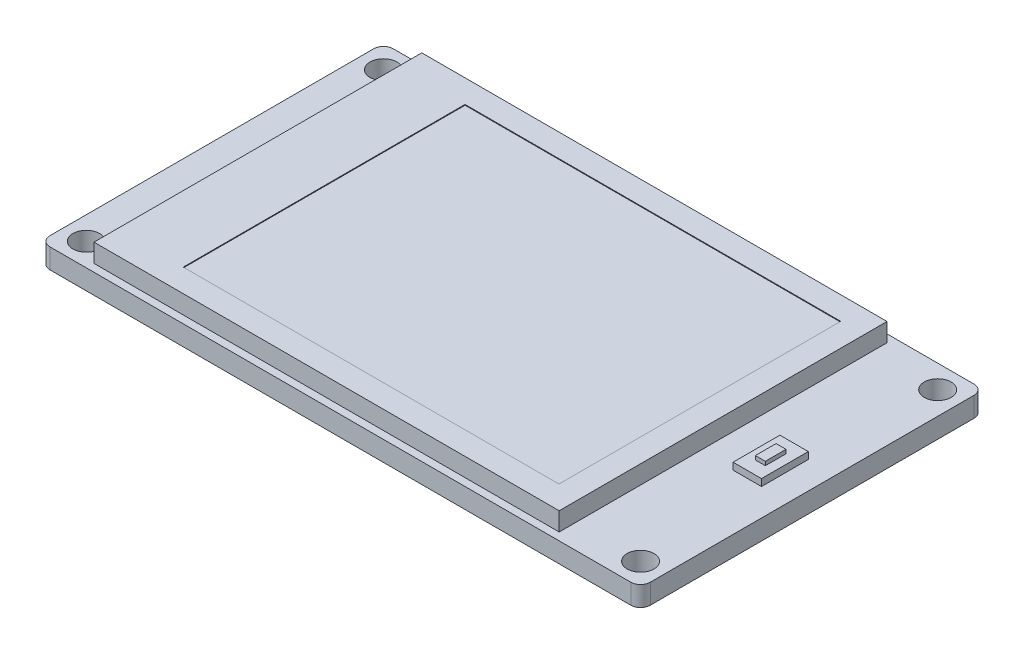
ISO-10303-21;
HEADER;
FILE_DESCRIPTION(('STEP AP214'),'2;1');
FILE_NAME('part.step','',(''),(''),'','','');
FILE_SCHEMA(('AUTOMOTIVE_DESIGN { 1 0 10303 214 1 1 1 1 }'));
ENDSEC;
DATA;
#1=APPLICATION_CONTEXT('core data for automotive mechanical design processes');
#2=APPLICATION_PROTOCOL_DEFINITION('international standard','automotive_design',2000,#1);
#3=PRODUCT_CONTEXT('',#1,'mechanical');
#4=PRODUCT('Part','Part','',(#3));
#5=PRODUCT_RELATED_PRODUCT_CATEGORY('part','',(#4));
#6=PRODUCT_DEFINITION_FORMATION('','',#4);
#7=PRODUCT_DEFINITION_CONTEXT('part definition',#1,'design');
#8=PRODUCT_DEFINITION('design','',#6,#7);
#9=PRODUCT_DEFINITION_SHAPE('','',#8);
#10=(LENGTH_UNIT() NAMED_UNIT(*) SI_UNIT(.MILLI.,.METRE.));
#11=(NAMED_UNIT(*) PLANE_ANGLE_UNIT() SI_UNIT($,.RADIAN.));
#12=(NAMED_UNIT(*) SI_UNIT($,.STERADIAN.) SOLID_ANGLE_UNIT());
#13=UNCERTAINTY_MEASURE_WITH_UNIT(LENGTH_MEASURE(1.E-05),#10,'distance_accuracy_value','');
#14=(GEOMETRIC_REPRESENTATION_CONTEXT(3) GLOBAL_UNCERTAINTY_ASSIGNED_CONTEXT((#13)) GLOBAL_UNIT_ASSIGNED_CONTEXT((#10,
#11,#12)) REPRESENTATION_CONTEXT('',''));
#15=CARTESIAN_POINT('',(0.,0.,0.));
#16=DIRECTION('',(0.,0.,1.));
#17=DIRECTION('',(1.,0.,0.));
#18=AXIS2_PLACEMENT_3D('',#15,#16,#17);
#19=CARTESIAN_POINT('',(-39.61,-2.,-13.14));
#20=DIRECTION('',(-1.,0.,0.));
#21=DIRECTION('',(0.,0.,1.));
#22=AXIS2_PLACEMENT_3D('',#19,#20,#21);
#23=PLANE('',#22);
#24=DIRECTION('',(0.,0.,1.));
#25=VECTOR('',#24,1.);
#26=CARTESIAN_POINT('',(-39.61,0.,-13.14));
#27=LINE('',#26,#25);
#28=CARTESIAN_POINT('',(-39.61,0.,-13.14));
#29=VERTEX_POINT('',#28);
#30=CARTESIAN_POINT('',(-39.61,0.,13.36));
#31=VERTEX_POINT('',#30);
#32=EDGE_CURVE('E115',#29,#31,#27,.T.);
#33=ORIENTED_EDGE('',*,*,#32,.F.);
#34=DIRECTION('',(0.,1.,0.));
#35=VECTOR('',#34,1.);
#36=CARTESIAN_POINT('',(-39.61,-2.,-13.14));
#37=LINE('',#36,#35);
#38=CARTESIAN_POINT('',(-39.61,-2.,-13.14));
#39=VERTEX_POINT('',#38);
#40=EDGE_CURVE('E12',#39,#29,#37,.T.);
#41=ORIENTED_EDGE('',*,*,#40,.F.);
#42=DIRECTION('',(0.,0.,1.));
#43=VECTOR('',#42,1.);
#44=CARTESIAN_POINT('',(-39.61,-2.,-13.14));
#45=LINE('',#44,#43);
#46=CARTESIAN_POINT('',(-39.61,-2.,13.36));
#47=VERTEX_POINT('',#46);
#48=EDGE_CURVE('E109',#39,#47,#45,.T.);
#49=ORIENTED_EDGE('',*,*,#48,.T.);
#50=DIRECTION('',(0.,1.,0.));
#51=VECTOR('',#50,1.);
#52=CARTESIAN_POINT('',(-39.61,-2.,13.36));
#53=LINE('',#52,#51);
#54=EDGE_CURVE('E54',#47,#31,#53,.T.);
#55=ORIENTED_EDGE('',*,*,#54,.T.);
#56=EDGE_LOOP('',(#33,#41,#49,#55));
#57=FACE_BOUND('',#56,.T.);
#58=ADVANCED_FACE('F51',(#57),#23,.T.);
#59=CARTESIAN_POINT('',(-39.61,-2.,-13.14));
#60=DIRECTION('',(0.,0.,-1.));
#61=DIRECTION('',(-1.,0.,0.));
#62=AXIS2_PLACEMENT_3D('',#59,#60,#61);
#63=PLANE('',#62);
#64=DIRECTION('',(-1.,0.,0.));
#65=VECTOR('',#64,1.);
#66=CARTESIAN_POINT('',(-39.61,0.,-13.14));
#67=LINE('',#66,#65);
#68=CARTESIAN_POINT('',(-39.11,0.,-13.14));
#69=VERTEX_POINT('',#68);
#70=EDGE_CURVE('E111',#69,#29,#67,.T.);
#71=ORIENTED_EDGE('',*,*,#70,.F.);
#72=DIRECTION('',(0.,1.,0.));
#73=VECTOR('',#72,1.);
#74=CARTESIAN_POINT('',(-39.11,-2.,-13.14));
#75=LINE('',#74,#73);
#76=CARTESIAN_POINT('',(-39.11,-2.,-13.14));
#77=VERTEX_POINT('',#76);
#78=EDGE_CURVE('E60',#77,#69,#75,.T.);
#79=ORIENTED_EDGE('',*,*,#78,.F.);
#80=DIRECTION('',(-1.,0.,0.));
#81=VECTOR('',#80,1.);
#82=CARTESIAN_POINT('',(-39.61,-2.,-13.14));
#83=LINE('',#82,#81);
#84=EDGE_CURVE('E106',#77,#39,#83,.T.);
#85=ORIENTED_EDGE('',*,*,#84,.T.);
#86=ORIENTED_EDGE('',*,*,#40,.T.);
#87=EDGE_LOOP('',(#71,#79,#85,#86));
#88=FACE_BOUND('',#87,.T.);
#89=ADVANCED_FACE('F125',(#88),#63,.T.);
#90=CARTESIAN_POINT('',(-39.11,-2.,-13.14));
#91=DIRECTION('',(1.,0.,0.));
#92=DIRECTION('',(0.,0.,-1.));
#93=AXIS2_PLACEMENT_3D('',#90,#91,#92);
#94=PLANE('',#93);
#95=DIRECTION('',(0.,0.,-1.));
#96=VECTOR('',#95,1.);
#97=CARTESIAN_POINT('',(-39.11,0.,-13.14));
#98=LINE('',#97,#96);
#99=CARTESIAN_POINT('',(-39.11,0.,13.36));
#100=VERTEX_POINT('',#99);
#101=EDGE_CURVE('E101',#100,#69,#98,.T.);
#102=ORIENTED_EDGE('',*,*,#101,.F.);
#103=DIRECTION('',(0.,1.,0.));
#104=VECTOR('',#103,1.);
#105=CARTESIAN_POINT('',(-39.11,-2.,13.36));
#106=LINE('',#105,#104);
#107=CARTESIAN_POINT('',(-39.11,-2.,13.36));
#108=VERTEX_POINT('',#107);
#109=EDGE_CURVE('E96',#108,#100,#106,.T.);
#110=ORIENTED_EDGE('',*,*,#109,.F.);
#111=DIRECTION('',(0.,0.,-1.));
#112=VECTOR('',#111,1.);
#113=CARTESIAN_POINT('',(-39.11,-2.,-13.14));
#114=LINE('',#113,#112);
#115=EDGE_CURVE('E99',#108,#77,#114,.T.);
#116=ORIENTED_EDGE('',*,*,#115,.T.);
#117=ORIENTED_EDGE('',*,*,#78,.T.);
#118=EDGE_LOOP('',(#102,#110,#116,#117));
#119=FACE_BOUND('',#118,.T.);
#120=ADVANCED_FACE('F98',(#119),#94,.T.);
#121=CARTESIAN_POINT('',(-39.61,-2.,13.36));
#122=DIRECTION('',(0.,0.,1.));
#123=DIRECTION('',(1.,0.,0.));
#124=AXIS2_PLACEMENT_3D('',#121,#122,#123);
#125=PLANE('',#124);
#126=DIRECTION('',(1.,0.,0.));
#127=VECTOR('',#126,1.);
#128=CARTESIAN_POINT('',(-39.61,0.,13.36));
#129=LINE('',#128,#127);
#130=EDGE_CURVE('E118',#31,#100,#129,.T.);
#131=ORIENTED_EDGE('',*,*,#130,.F.);
#132=ORIENTED_EDGE('',*,*,#54,.F.);
#133=DIRECTION('',(1.,0.,0.));
#134=VECTOR('',#133,1.);
#135=CARTESIAN_POINT('',(-39.61,-2.,13.36));
#136=LINE('',#135,#134);
#137=EDGE_CURVE('E105',#47,#108,#136,.T.);
#138=ORIENTED_EDGE('',*,*,#137,.T.);
#139=ORIENTED_EDGE('',*,*,#109,.T.);
#140=EDGE_LOOP('',(#131,#132,#138,#139));
#141=FACE_BOUND('',#140,.T.);
#142=ADVANCED_FACE('F108',(#141),#125,.T.);
#143=CARTESIAN_POINT('',(0.,-2.,0.));
#144=DIRECTION('',(0.,1.,0.));
#145=DIRECTION('',(0.,0.,1.));
#146=AXIS2_PLACEMENT_3D('',#143,#144,#145);
#147=PLANE('',#146);
#148=ORIENTED_EDGE('',*,*,#48,.F.);
#149=ORIENTED_EDGE('',*,*,#84,.F.);
#150=ORIENTED_EDGE('',*,*,#115,.F.);
#151=ORIENTED_EDGE('',*,*,#137,.F.);
#152=EDGE_LOOP('',(#148,#149,#150,#151));
#153=FACE_BOUND('',#152,.T.);
#154=ADVANCED_FACE('F104',(#153),#147,.F.);
#155=CARTESIAN_POINT('',(0.,0.,0.));
#156=DIRECTION('',(0.,1.,0.));
#157=DIRECTION('',(0.,0.,1.));
#158=AXIS2_PLACEMENT_3D('',#155,#156,#157);
#159=PLANE('',#158);
#160=ORIENTED_EDGE('',*,*,#32,.T.);
#161=ORIENTED_EDGE('',*,*,#130,.T.);
#162=ORIENTED_EDGE('',*,*,#101,.T.);
#163=ORIENTED_EDGE('',*,*,#70,.T.);
#164=EDGE_LOOP('',(#160,#161,#162,#163));
#165=FACE_BOUND('',#164,.T.);
#166=ADVANCED_FACE('F124',(#165),#159,.T.);
#167=CLOSED_SHELL('',(#58,#89,#120,#142,#154,#166));
#168=MANIFOLD_SOLID_BREP('B2',#167);
#169=CARTESIAN_POINT('',(0.,2.6,0.));
#170=DIRECTION('',(0.,1.,0.));
#171=DIRECTION('',(0.,0.,1.));
#172=AXIS2_PLACEMENT_3D('',#169,#170,#171);
#173=PLANE('',#172);
#174=CARTESIAN_POINT('',(-36.11,2.6,-19.36));
#175=DIRECTION('',(0.,1.,0.));
#176=DIRECTION('',(0.,0.,1.));
#177=AXIS2_PLACEMENT_3D('',#174,#175,#176);
#178=CIRCLE('',#177,1.75);
#179=CARTESIAN_POINT('',(-36.11,2.6,-17.61));
#180=VERTEX_POINT('',#179);
#181=EDGE_CURVE('E467',#180,#180,#178,.F.);
#182=ORIENTED_EDGE('',*,*,#181,.T.);
#183=EDGE_LOOP('',(#182));
#184=FACE_BOUND('',#183,.T.);
#185=DIRECTION('',(1.,0.,0.));
#186=VECTOR('',#185,1.);
#187=CARTESIAN_POINT('',(0.,2.6,22.36));
#188=LINE('',#187,#186);
#189=CARTESIAN_POINT('',(-37.84,2.6,22.36));
#190=VERTEX_POINT('',#189);
#191=CARTESIAN_POINT('',(37.84,2.6,22.36));
#192=VERTEX_POINT('',#191);
#193=EDGE_CURVE('E443',#190,#192,#188,.T.);
#194=ORIENTED_EDGE('',*,*,#193,.T.);
#195=CARTESIAN_POINT('',(37.84,2.6,21.09));
#196=DIRECTION('',(0.,1.,0.));
#197=DIRECTION('',(0.,0.,1.));
#198=AXIS2_PLACEMENT_3D('',#195,#196,#197);
#199=CIRCLE('',#198,1.27);
#200=CARTESIAN_POINT('',(39.11,2.6,21.09));
#201=VERTEX_POINT('',#200);
#202=EDGE_CURVE('E446',#192,#201,#199,.T.);
#203=ORIENTED_EDGE('',*,*,#202,.T.);
#204=DIRECTION('',(0.,0.,1.));
#205=VECTOR('',#204,1.);
#206=CARTESIAN_POINT('',(39.11,2.6,0.));
#207=LINE('',#206,#205);
#208=CARTESIAN_POINT('',(39.11,2.6,-21.09));
#209=VERTEX_POINT('',#208);
#210=EDGE_CURVE('E449',#209,#201,#207,.T.);
#211=ORIENTED_EDGE('',*,*,#210,.F.);
#212=CARTESIAN_POINT('',(37.84,2.6,-21.09));
#213=DIRECTION('',(0.,1.,0.));
#214=DIRECTION('',(0.,0.,1.));
#215=AXIS2_PLACEMENT_3D('',#212,#213,#214);
#216=CIRCLE('',#215,1.27);
#217=CARTESIAN_POINT('',(37.84,2.6,-22.36));
#218=VERTEX_POINT('',#217);
#219=EDGE_CURVE('E452',#218,#209,#216,.F.);
#220=ORIENTED_EDGE('',*,*,#219,.F.);
#221=DIRECTION('',(1.,0.,0.));
#222=VECTOR('',#221,1.);
#223=CARTESIAN_POINT('',(0.,2.6,-22.36));
#224=LINE('',#223,#222);
#225=CARTESIAN_POINT('',(-37.84,2.6,-22.36));
#226=VERTEX_POINT('',#225);
#227=EDGE_CURVE('E455',#226,#218,#224,.T.);
#228=ORIENTED_EDGE('',*,*,#227,.F.);
#229=CARTESIAN_POINT('',(-37.84,2.6,-21.09));
#230=DIRECTION('',(0.,1.,0.));
#231=DIRECTION('',(0.,0.,1.));
#232=AXIS2_PLACEMENT_3D('',#229,#230,#231);
#233=CIRCLE('',#232,1.27);
#234=CARTESIAN_POINT('',(-39.11,2.6,-21.09));
#235=VERTEX_POINT('',#234);
#236=EDGE_CURVE('E458',#226,#235,#233,.T.);
#237=ORIENTED_EDGE('',*,*,#236,.T.);
#238=DIRECTION('',(0.,0.,1.));
#239=VECTOR('',#238,1.);
#240=CARTESIAN_POINT('',(-39.11,2.6,0.));
#241=LINE('',#240,#239);
#242=CARTESIAN_POINT('',(-39.11,2.6,21.09));
#243=VERTEX_POINT('',#242);
#244=EDGE_CURVE('E461',#235,#243,#241,.T.);
#245=ORIENTED_EDGE('',*,*,#244,.T.);
#246=CARTESIAN_POINT('',(-37.84,2.6,21.09));
#247=DIRECTION('',(0.,1.,0.));
#248=DIRECTION('',(0.,0.,1.));
#249=AXIS2_PLACEMENT_3D('',#246,#247,#248);
#250=CIRCLE('',#249,1.27);
#251=EDGE_CURVE('E464',#243,#190,#250,.T.);
#252=ORIENTED_EDGE('',*,*,#251,.T.);
#253=EDGE_LOOP('',(#194,#203,#211,#220,#228,#237,#245,#252));
#254=FACE_BOUND('',#253,.T.);
#255=CARTESIAN_POINT('',(-36.11,2.6,19.36));
#256=DIRECTION('',(0.,1.,0.));
#257=DIRECTION('',(0.,0.,1.));
#258=AXIS2_PLACEMENT_3D('',#255,#256,#257);
#259=CIRCLE('',#258,1.75);
#260=CARTESIAN_POINT('',(-36.11,2.6,21.11));
#261=VERTEX_POINT('',#260);
#262=EDGE_CURVE('E440',#261,#261,#259,.T.);
#263=ORIENTED_EDGE('',*,*,#262,.F.);
#264=EDGE_LOOP('',(#263));
#265=FACE_BOUND('',#264,.T.);
#266=DIRECTION('',(1.,0.,0.));
#267=VECTOR('',#266,1.);
#268=CARTESIAN_POINT('',(0.,2.6,-21.36));
#269=LINE('',#268,#267);
#270=CARTESIAN_POINT('',(-33.11,2.6,-21.36));
#271=VERTEX_POINT('',#270);
#272=CARTESIAN_POINT('',(27.51,2.6,-21.36));
#273=VERTEX_POINT('',#272);
#274=EDGE_CURVE('E430',#271,#273,#269,.T.);
#275=ORIENTED_EDGE('',*,*,#274,.T.);
#276=DIRECTION('',(0.,0.,1.));
#277=VECTOR('',#276,1.);
#278=CARTESIAN_POINT('',(27.51,2.6,0.));
#279=LINE('',#278,#277);
#280=CARTESIAN_POINT('',(27.51,2.6,21.36));
#281=VERTEX_POINT('',#280);
#282=EDGE_CURVE('E432',#273,#281,#279,.T.);
#283=ORIENTED_EDGE('',*,*,#282,.T.);
#284=DIRECTION('',(1.,0.,0.));
#285=VECTOR('',#284,1.);
#286=CARTESIAN_POINT('',(0.,2.6,21.36));
#287=LINE('',#286,#285);
#288=CARTESIAN_POINT('',(-33.11,2.6,21.36));
#289=VERTEX_POINT('',#288);
#290=EDGE_CURVE('E434',#289,#281,#287,.T.);
#291=ORIENTED_EDGE('',*,*,#290,.F.);
#292=DIRECTION('',(0.,0.,1.));
#293=VECTOR('',#292,1.);
#294=CARTESIAN_POINT('',(-33.11,2.6,0.));
#295=LINE('',#294,#293);
#296=EDGE_CURVE('E437',#271,#289,#295,.T.);
#297=ORIENTED_EDGE('',*,*,#296,.F.);
#298=EDGE_LOOP('',(#275,#283,#291,#297));
#299=FACE_BOUND('',#298,.T.);
#300=CARTESIAN_POINT('',(36.11,2.6,19.36));
#301=DIRECTION('',(0.,1.,0.));
#302=DIRECTION('',(0.,0.,1.));
#303=AXIS2_PLACEMENT_3D('',#300,#301,#302);
#304=CIRCLE('',#303,1.75);
#305=CARTESIAN_POINT('',(36.11,2.6,21.11));
#306=VERTEX_POINT('',#305);
#307=EDGE_CURVE('E427',#306,#306,#304,.F.);
#308=ORIENTED_EDGE('',*,*,#307,.T.);
#309=EDGE_LOOP('',(#308));
#310=FACE_BOUND('',#309,.T.);
#311=CARTESIAN_POINT('',(36.11,2.6,-19.36));
#312=DIRECTION('',(0.,1.,0.));
#313=DIRECTION('',(0.,0.,1.));
#314=AXIS2_PLACEMENT_3D('',#311,#312,#313);
#315=CIRCLE('',#314,1.75);
#316=CARTESIAN_POINT('',(36.11,2.6,-17.61));
#317=VERTEX_POINT('',#316);
#318=EDGE_CURVE('E418',#317,#317,#315,.T.);
#319=ORIENTED_EDGE('',*,*,#318,.F.);
#320=EDGE_LOOP('',(#319));
#321=FACE_BOUND('',#320,.T.);
#322=DIRECTION('',(0.,0.,1.));
#323=VECTOR('',#322,1.);
#324=CARTESIAN_POINT('',(35.56,2.6,0.));
#325=LINE('',#324,#323);
#326=CARTESIAN_POINT('',(35.56,2.6,-3.05));
#327=VERTEX_POINT('',#326);
#328=CARTESIAN_POINT('',(35.56,2.6,3.05));
#329=VERTEX_POINT('',#328);
#330=EDGE_CURVE('E183',#327,#329,#325,.T.);
#331=ORIENTED_EDGE('',*,*,#330,.T.);
#332=DIRECTION('',(-1.,0.,0.));
#333=VECTOR('',#332,1.);
#334=CARTESIAN_POINT('',(0.,2.6,3.05));
#335=LINE('',#334,#333);
#336=CARTESIAN_POINT('',(31.86,2.6,3.05));
#337=VERTEX_POINT('',#336);
#338=EDGE_CURVE('E49',#329,#337,#335,.T.);
#339=ORIENTED_EDGE('',*,*,#338,.T.);
#340=DIRECTION('',(0.,0.,1.));
#341=VECTOR('',#340,1.);
#342=CARTESIAN_POINT('',(31.86,2.6,0.));
#343=LINE('',#342,#341);
#344=CARTESIAN_POINT('',(31.86,2.6,-3.05));
#345=VERTEX_POINT('',#344);
#346=EDGE_CURVE('E545',#345,#337,#343,.T.);
#347=ORIENTED_EDGE('',*,*,#346,.F.);
#348=DIRECTION('',(-1.,0.,0.));
#349=VECTOR('',#348,1.);
#350=CARTESIAN_POINT('',(0.,2.6,-3.05));
#351=LINE('',#350,#349);
#352=EDGE_CURVE('E193',#327,#345,#351,.T.);
#353=ORIENTED_EDGE('',*,*,#352,.F.);
#354=EDGE_LOOP('',(#331,#339,#347,#353));
#355=FACE_BOUND('',#354,.T.);
#356=ADVANCED_FACE('F175',(#184,#254,#265,#299,#310,#321,#355),#173,.T.);
#357=CARTESIAN_POINT('',(0.,1.6,22.36));
#358=DIRECTION('',(0.,0.,-1.));
#359=DIRECTION('',(-1.,0.,0.));
#360=AXIS2_PLACEMENT_3D('',#357,#358,#359);
#361=PLANE('',#360);
#362=DIRECTION('',(1.,0.,0.));
#363=VECTOR('',#362,1.);
#364=CARTESIAN_POINT('',(0.,0.,22.36));
#365=LINE('',#364,#363);
#366=CARTESIAN_POINT('',(-37.84,0.,22.36));
#367=VERTEX_POINT('',#366);
#368=CARTESIAN_POINT('',(37.84,0.,22.36));
#369=VERTEX_POINT('',#368);
#370=EDGE_CURVE('E501',#367,#369,#365,.T.);
#371=ORIENTED_EDGE('',*,*,#370,.T.);
#372=DIRECTION('',(0.,-1.,0.));
#373=VECTOR('',#372,1.);
#374=CARTESIAN_POINT('',(37.84,1.6,22.36));
#375=LINE('',#374,#373);
#376=EDGE_CURVE('E542',#192,#369,#375,.T.);
#377=ORIENTED_EDGE('',*,*,#376,.F.);
#378=ORIENTED_EDGE('',*,*,#193,.F.);
#379=DIRECTION('',(0.,-1.,0.));
#380=VECTOR('',#379,1.);
#381=CARTESIAN_POINT('',(-37.84,1.6,22.36));
#382=LINE('',#381,#380);
#383=EDGE_CURVE('E525',#190,#367,#382,.T.);
#384=ORIENTED_EDGE('',*,*,#383,.T.);
#385=EDGE_LOOP('',(#371,#377,#378,#384));
#386=FACE_BOUND('',#385,.T.);
#387=ADVANCED_FACE('F564',(#386),#361,.F.);
#388=CARTESIAN_POINT('',(37.84,1.6,21.09));
#389=DIRECTION('',(0.,-1.,0.));
#390=DIRECTION('',(0.,0.,-1.));
#391=AXIS2_PLACEMENT_3D('',#388,#389,#390);
#392=CYLINDRICAL_SURFACE('',#391,1.27);
#393=CARTESIAN_POINT('',(37.84,0.,21.09));
#394=DIRECTION('',(0.,1.,0.));
#395=DIRECTION('',(0.,0.,1.));
#396=AXIS2_PLACEMENT_3D('',#393,#394,#395);
#397=CIRCLE('',#396,1.27);
#398=CARTESIAN_POINT('',(39.11,0.,21.09));
#399=VERTEX_POINT('',#398);
#400=EDGE_CURVE('E504',#369,#399,#397,.T.);
#401=ORIENTED_EDGE('',*,*,#400,.T.);
#402=DIRECTION('',(0.,-1.,0.));
#403=VECTOR('',#402,1.);
#404=CARTESIAN_POINT('',(39.11,1.6,21.09));
#405=LINE('',#404,#403);
#406=EDGE_CURVE('E540',#201,#399,#405,.T.);
#407=ORIENTED_EDGE('',*,*,#406,.F.);
#408=ORIENTED_EDGE('',*,*,#202,.F.);
#409=ORIENTED_EDGE('',*,*,#376,.T.);
#410=EDGE_LOOP('',(#401,#407,#408,#409));
#411=FACE_BOUND('',#410,.T.);
#412=ADVANCED_FACE('F572',(#411),#392,.T.);
#413=CARTESIAN_POINT('',(39.11,1.6,0.));
#414=DIRECTION('',(1.,0.,0.));
#415=DIRECTION('',(0.,0.,-1.));
#416=AXIS2_PLACEMENT_3D('',#413,#414,#415);
#417=PLANE('',#416);
#418=DIRECTION('',(0.,0.,1.));
#419=VECTOR('',#418,1.);
#420=CARTESIAN_POINT('',(39.11,0.,0.));
#421=LINE('',#420,#419);
#422=CARTESIAN_POINT('',(39.11,0.,-21.09));
#423=VERTEX_POINT('',#422);
#424=EDGE_CURVE('E507',#423,#399,#421,.T.);
#425=ORIENTED_EDGE('',*,*,#424,.F.);
#426=DIRECTION('',(0.,-1.,0.));
#427=VECTOR('',#426,1.);
#428=CARTESIAN_POINT('',(39.11,1.6,-21.09));
#429=LINE('',#428,#427);
#430=EDGE_CURVE('E538',#209,#423,#429,.T.);
#431=ORIENTED_EDGE('',*,*,#430,.F.);
#432=ORIENTED_EDGE('',*,*,#210,.T.);
#433=ORIENTED_EDGE('',*,*,#406,.T.);
#434=EDGE_LOOP('',(#425,#431,#432,#433));
#435=FACE_BOUND('',#434,.T.);
#436=ADVANCED_FACE('F628',(#435),#417,.T.);
#437=CARTESIAN_POINT('',(37.84,1.6,-21.09));
#438=DIRECTION('',(0.,-1.,0.));
#439=DIRECTION('',(0.,0.,-1.));
#440=AXIS2_PLACEMENT_3D('',#437,#438,#439);
#441=CYLINDRICAL_SURFACE('',#440,1.27);
#442=CARTESIAN_POINT('',(37.84,0.,-21.09));
#443=DIRECTION('',(0.,1.,0.));
#444=DIRECTION('',(0.,0.,1.));
#445=AXIS2_PLACEMENT_3D('',#442,#443,#444);
#446=CIRCLE('',#445,1.27);
#447=CARTESIAN_POINT('',(37.84,0.,-22.36));
#448=VERTEX_POINT('',#447);
#449=EDGE_CURVE('E510',#448,#423,#446,.F.);
#450=ORIENTED_EDGE('',*,*,#449,.F.);
#451=DIRECTION('',(0.,-1.,0.));
#452=VECTOR('',#451,1.);
#453=CARTESIAN_POINT('',(37.84,1.6,-22.36));
#454=LINE('',#453,#452);
#455=EDGE_CURVE('E536',#218,#448,#454,.T.);
#456=ORIENTED_EDGE('',*,*,#455,.F.);
#457=ORIENTED_EDGE('',*,*,#219,.T.);
#458=ORIENTED_EDGE('',*,*,#430,.T.);
#459=EDGE_LOOP('',(#450,#456,#457,#458));
#460=FACE_BOUND('',#459,.T.);
#461=ADVANCED_FACE('F624',(#460),#441,.T.);
#462=CARTESIAN_POINT('',(0.,1.6,-22.36));
#463=DIRECTION('',(0.,0.,-1.));
#464=DIRECTION('',(-1.,0.,0.));
#465=AXIS2_PLACEMENT_3D('',#462,#463,#464);
#466=PLANE('',#465);
#467=DIRECTION('',(1.,0.,0.));
#468=VECTOR('',#467,1.);
#469=CARTESIAN_POINT('',(0.,0.,-22.36));
#470=LINE('',#469,#468);
#471=CARTESIAN_POINT('',(-37.84,0.,-22.36));
#472=VERTEX_POINT('',#471);
#473=EDGE_CURVE('E513',#472,#448,#470,.T.);
#474=ORIENTED_EDGE('',*,*,#473,.F.);
#475=DIRECTION('',(0.,-1.,0.));
#476=VECTOR('',#475,1.);
#477=CARTESIAN_POINT('',(-37.84,1.6,-22.36));
#478=LINE('',#477,#476);
#479=EDGE_CURVE('E534',#226,#472,#478,.T.);
#480=ORIENTED_EDGE('',*,*,#479,.F.);
#481=ORIENTED_EDGE('',*,*,#227,.T.);
#482=ORIENTED_EDGE('',*,*,#455,.T.);
#483=EDGE_LOOP('',(#474,#480,#481,#482));
#484=FACE_BOUND('',#483,.T.);
#485=ADVANCED_FACE('F620',(#484),#466,.T.);
#486=CARTESIAN_POINT('',(-37.84,1.6,-21.09));
#487=DIRECTION('',(0.,-1.,0.));
#488=DIRECTION('',(0.,0.,-1.));
#489=AXIS2_PLACEMENT_3D('',#486,#487,#488);
#490=CYLINDRICAL_SURFACE('',#489,1.27);
#491=CARTESIAN_POINT('',(-37.84,0.,-21.09));
#492=DIRECTION('',(0.,1.,0.));
#493=DIRECTION('',(0.,0.,1.));
#494=AXIS2_PLACEMENT_3D('',#491,#492,#493);
#495=CIRCLE('',#494,1.27);
#496=CARTESIAN_POINT('',(-39.11,0.,-21.09));
#497=VERTEX_POINT('',#496);
#498=EDGE_CURVE('E516',#472,#497,#495,.T.);
#499=ORIENTED_EDGE('',*,*,#498,.T.);
#500=DIRECTION('',(0.,-1.,0.));
#501=VECTOR('',#500,1.);
#502=CARTESIAN_POINT('',(-39.11,1.6,-21.09));
#503=LINE('',#502,#501);
#504=EDGE_CURVE('E531',#235,#497,#503,.T.);
#505=ORIENTED_EDGE('',*,*,#504,.F.);
#506=ORIENTED_EDGE('',*,*,#236,.F.);
#507=ORIENTED_EDGE('',*,*,#479,.T.);
#508=EDGE_LOOP('',(#499,#505,#506,#507));
#509=FACE_BOUND('',#508,.T.);
#510=ADVANCED_FACE('F616',(#509),#490,.T.);
#511=CARTESIAN_POINT('',(-39.11,1.6,0.));
#512=DIRECTION('',(1.,0.,0.));
#513=DIRECTION('',(0.,0.,-1.));
#514=AXIS2_PLACEMENT_3D('',#511,#512,#513);
#515=PLANE('',#514);
#516=DIRECTION('',(0.,0.,1.));
#517=VECTOR('',#516,1.);
#518=CARTESIAN_POINT('',(-39.11,0.,0.));
#519=LINE('',#518,#517);
#520=CARTESIAN_POINT('',(-39.11,0.,21.09));
#521=VERTEX_POINT('',#520);
#522=EDGE_CURVE('E518',#497,#521,#519,.T.);
#523=ORIENTED_EDGE('',*,*,#522,.T.);
#524=DIRECTION('',(0.,-1.,0.));
#525=VECTOR('',#524,1.);
#526=CARTESIAN_POINT('',(-39.11,1.6,21.09));
#527=LINE('',#526,#525);
#528=EDGE_CURVE('E528',#243,#521,#527,.T.);
#529=ORIENTED_EDGE('',*,*,#528,.F.);
#530=ORIENTED_EDGE('',*,*,#244,.F.);
#531=ORIENTED_EDGE('',*,*,#504,.T.);
#532=EDGE_LOOP('',(#523,#529,#530,#531));
#533=FACE_BOUND('',#532,.T.);
#534=ADVANCED_FACE('F612',(#533),#515,.F.);
#535=CARTESIAN_POINT('',(-37.84,1.6,21.09));
#536=DIRECTION('',(0.,-1.,0.));
#537=DIRECTION('',(0.,0.,-1.));
#538=AXIS2_PLACEMENT_3D('',#535,#536,#537);
#539=CYLINDRICAL_SURFACE('',#538,1.27);
#540=CARTESIAN_POINT('',(-37.84,0.,21.09));
#541=DIRECTION('',(0.,1.,0.));
#542=DIRECTION('',(0.,0.,1.));
#543=AXIS2_PLACEMENT_3D('',#540,#541,#542);
#544=CIRCLE('',#543,1.27);
#545=EDGE_CURVE('E520',#521,#367,#544,.T.);
#546=ORIENTED_EDGE('',*,*,#545,.T.);
#547=ORIENTED_EDGE('',*,*,#383,.F.);
#548=ORIENTED_EDGE('',*,*,#251,.F.);
#549=ORIENTED_EDGE('',*,*,#528,.T.);
#550=EDGE_LOOP('',(#546,#547,#548,#549));
#551=FACE_BOUND('',#550,.T.);
#552=ADVANCED_FACE('F608',(#551),#539,.T.);
#553=CARTESIAN_POINT('',(-36.11,1.6,19.36));
#554=DIRECTION('',(0.,-1.,0.));
#555=DIRECTION('',(0.,0.,-1.));
#556=AXIS2_PLACEMENT_3D('',#553,#554,#555);
#557=CYLINDRICAL_SURFACE('',#556,1.75);
#558=CARTESIAN_POINT('',(-36.11,0.,19.36));
#559=DIRECTION('',(0.,1.,0.));
#560=DIRECTION('',(0.,0.,1.));
#561=AXIS2_PLACEMENT_3D('',#558,#559,#560);
#562=CIRCLE('',#561,1.75);
#563=CARTESIAN_POINT('',(-36.11,0.,21.11));
#564=VERTEX_POINT('',#563);
#565=EDGE_CURVE('E498',#564,#564,#562,.T.);
#566=ORIENTED_EDGE('',*,*,#565,.F.);
#567=EDGE_LOOP('',(#566));
#568=FACE_BOUND('',#567,.T.);
#569=ORIENTED_EDGE('',*,*,#262,.T.);
#570=EDGE_LOOP('',(#569));
#571=FACE_BOUND('',#570,.T.);
#572=ADVANCED_FACE('F611',(#568,#571),#557,.F.);
#573=CARTESIAN_POINT('',(36.11,1.6,19.36));
#574=DIRECTION('',(0.,-1.,0.));
#575=DIRECTION('',(0.,0.,-1.));
#576=AXIS2_PLACEMENT_3D('',#573,#574,#575);
#577=CYLINDRICAL_SURFACE('',#576,1.75);
#578=CARTESIAN_POINT('',(36.11,0.,19.36));
#579=DIRECTION('',(0.,1.,0.));
#580=DIRECTION('',(0.,0.,1.));
#581=AXIS2_PLACEMENT_3D('',#578,#579,#580);
#582=CIRCLE('',#581,1.75);
#583=CARTESIAN_POINT('',(36.11,0.,21.11));
#584=VERTEX_POINT('',#583);
#585=EDGE_CURVE('E495',#584,#584,#582,.F.);
#586=ORIENTED_EDGE('',*,*,#585,.T.);
#587=EDGE_LOOP('',(#586));
#588=FACE_BOUND('',#587,.T.);
#589=ORIENTED_EDGE('',*,*,#307,.F.);
#590=EDGE_LOOP('',(#589));
#591=FACE_BOUND('',#590,.T.);
#592=ADVANCED_FACE('F637',(#588,#591),#577,.F.);
#593=CARTESIAN_POINT('',(36.11,1.6,-19.36));
#594=DIRECTION('',(0.,-1.,0.));
#595=DIRECTION('',(0.,0.,-1.));
#596=AXIS2_PLACEMENT_3D('',#593,#594,#595);
#597=CYLINDRICAL_SURFACE('',#596,1.75);
#598=CARTESIAN_POINT('',(36.11,0.,-19.36));
#599=DIRECTION('',(0.,1.,0.));
#600=DIRECTION('',(0.,0.,1.));
#601=AXIS2_PLACEMENT_3D('',#598,#599,#600);
#602=CIRCLE('',#601,1.75);
#603=CARTESIAN_POINT('',(36.11,0.,-17.61));
#604=VERTEX_POINT('',#603);
#605=EDGE_CURVE('E492',#604,#604,#602,.T.);
#606=ORIENTED_EDGE('',*,*,#605,.F.);
#607=EDGE_LOOP('',(#606));
#608=FACE_BOUND('',#607,.T.);
#609=ORIENTED_EDGE('',*,*,#318,.T.);
#610=EDGE_LOOP('',(#609));
#611=FACE_BOUND('',#610,.T.);
#612=ADVANCED_FACE('F177',(#608,#611),#597,.F.);
#613=CARTESIAN_POINT('',(-36.11,1.6,-19.36));
#614=DIRECTION('',(0.,-1.,0.));
#615=DIRECTION('',(0.,0.,-1.));
#616=AXIS2_PLACEMENT_3D('',#613,#614,#615);
#617=CYLINDRICAL_SURFACE('',#616,1.75);
#618=CARTESIAN_POINT('',(-36.11,0.,-19.36));
#619=DIRECTION('',(0.,1.,0.));
#620=DIRECTION('',(0.,0.,1.));
#621=AXIS2_PLACEMENT_3D('',#618,#619,#620);
#622=CIRCLE('',#621,1.75);
#623=CARTESIAN_POINT('',(-36.11,0.,-17.61));
#624=VERTEX_POINT('',#623);
#625=EDGE_CURVE('E522',#624,#624,#622,.F.);
#626=ORIENTED_EDGE('',*,*,#625,.T.);
#627=EDGE_LOOP('',(#626));
#628=FACE_BOUND('',#627,.T.);
#629=ORIENTED_EDGE('',*,*,#181,.F.);
#630=EDGE_LOOP('',(#629));
#631=FACE_BOUND('',#630,.T.);
#632=ADVANCED_FACE('F603',(#628,#631),#617,.F.);
#633=CARTESIAN_POINT('',(0.,0.,0.));
#634=DIRECTION('',(0.,1.,0.));
#635=DIRECTION('',(0.,0.,1.));
#636=AXIS2_PLACEMENT_3D('',#633,#634,#635);
#637=PLANE('',#636);
#638=ORIENTED_EDGE('',*,*,#605,.T.);
#639=EDGE_LOOP('',(#638));
#640=FACE_BOUND('',#639,.T.);
#641=ORIENTED_EDGE('',*,*,#585,.F.);
#642=EDGE_LOOP('',(#641));
#643=FACE_BOUND('',#642,.T.);
#644=ORIENTED_EDGE('',*,*,#565,.T.);
#645=EDGE_LOOP('',(#644));
#646=FACE_BOUND('',#645,.T.);
#647=ORIENTED_EDGE('',*,*,#370,.F.);
#648=ORIENTED_EDGE('',*,*,#545,.F.);
#649=ORIENTED_EDGE('',*,*,#522,.F.);
#650=ORIENTED_EDGE('',*,*,#498,.F.);
#651=ORIENTED_EDGE('',*,*,#473,.T.);
#652=ORIENTED_EDGE('',*,*,#449,.T.);
#653=ORIENTED_EDGE('',*,*,#424,.T.);
#654=ORIENTED_EDGE('',*,*,#400,.F.);
#655=EDGE_LOOP('',(#647,#648,#649,#650,#651,#652,#653,#654));
#656=FACE_BOUND('',#655,.T.);
#657=ORIENTED_EDGE('',*,*,#625,.F.);
#658=EDGE_LOOP('',(#657));
#659=FACE_BOUND('',#658,.T.);
#660=ADVANCED_FACE('F584',(#640,#643,#646,#656,#659),#637,.F.);
#661=CARTESIAN_POINT('',(0.,5.,0.));
#662=DIRECTION('',(0.,1.,0.));
#663=DIRECTION('',(0.,0.,1.));
#664=AXIS2_PLACEMENT_3D('',#661,#662,#663);
#665=PLANE('',#664);
#666=DIRECTION('',(0.,0.,1.));
#667=VECTOR('',#666,1.);
#668=CARTESIAN_POINT('',(-24.4799999999999,5.,0.));
#669=LINE('',#668,#667);
#670=CARTESIAN_POINT('',(-24.4799999999999,5.,-18.36));
#671=VERTEX_POINT('',#670);
#672=CARTESIAN_POINT('',(-24.4799999999999,5.,18.36));
#673=VERTEX_POINT('',#672);
#674=EDGE_CURVE('E394',#671,#673,#669,.T.);
#675=ORIENTED_EDGE('',*,*,#674,.F.);
#676=DIRECTION('',(-1.,0.,0.));
#677=VECTOR('',#676,1.);
#678=CARTESIAN_POINT('',(0.,5.,-18.36));
#679=LINE('',#678,#677);
#680=CARTESIAN_POINT('',(24.4800000000001,5.,-18.36));
#681=VERTEX_POINT('',#680);
#682=EDGE_CURVE('E399',#681,#671,#679,.T.);
#683=ORIENTED_EDGE('',*,*,#682,.F.);
#684=DIRECTION('',(0.,0.,1.));
#685=VECTOR('',#684,1.);
#686=CARTESIAN_POINT('',(24.4800000000001,5.,0.));
#687=LINE('',#686,#685);
#688=CARTESIAN_POINT('',(24.4800000000001,5.,18.36));
#689=VERTEX_POINT('',#688);
#690=EDGE_CURVE('E411',#681,#689,#687,.T.);
#691=ORIENTED_EDGE('',*,*,#690,.T.);
#692=DIRECTION('',(-1.,0.,0.));
#693=VECTOR('',#692,1.);
#694=CARTESIAN_POINT('',(0.,5.,18.36));
#695=LINE('',#694,#693);
#696=EDGE_CURVE('E408',#689,#673,#695,.T.);
#697=ORIENTED_EDGE('',*,*,#696,.T.);
#698=EDGE_LOOP('',(#675,#683,#691,#697));
#699=FACE_BOUND('',#698,.T.);
#700=DIRECTION('',(0.,0.,1.));
#701=VECTOR('',#700,1.);
#702=CARTESIAN_POINT('',(27.51,5.,0.));
#703=LINE('',#702,#701);
#704=CARTESIAN_POINT('',(27.51,5.,-21.36));
#705=VERTEX_POINT('',#704);
#706=CARTESIAN_POINT('',(27.51,5.,21.36));
#707=VERTEX_POINT('',#706);
#708=EDGE_CURVE('E470',#705,#707,#703,.T.);
#709=ORIENTED_EDGE('',*,*,#708,.F.);
#710=DIRECTION('',(1.,0.,0.));
#711=VECTOR('',#710,1.);
#712=CARTESIAN_POINT('',(0.,5.,-21.36));
#713=LINE('',#712,#711);
#714=CARTESIAN_POINT('',(-33.11,5.,-21.36));
#715=VERTEX_POINT('',#714);
#716=EDGE_CURVE('E473',#715,#705,#713,.T.);
#717=ORIENTED_EDGE('',*,*,#716,.F.);
#718=DIRECTION('',(0.,0.,1.));
#719=VECTOR('',#718,1.);
#720=CARTESIAN_POINT('',(-33.11,5.,0.));
#721=LINE('',#720,#719);
#722=CARTESIAN_POINT('',(-33.11,5.,21.36));
#723=VERTEX_POINT('',#722);
#724=EDGE_CURVE('E476',#715,#723,#721,.T.);
#725=ORIENTED_EDGE('',*,*,#724,.T.);
#726=DIRECTION('',(1.,0.,0.));
#727=VECTOR('',#726,1.);
#728=CARTESIAN_POINT('',(0.,5.,21.36));
#729=LINE('',#728,#727);
#730=EDGE_CURVE('E478',#723,#707,#729,.T.);
#731=ORIENTED_EDGE('',*,*,#730,.T.);
#732=EDGE_LOOP('',(#709,#717,#725,#731));
#733=FACE_BOUND('',#732,.T.);
#734=ADVANCED_FACE('F580',(#699,#733),#665,.T.);
#735=CARTESIAN_POINT('',(0.,5.,21.36));
#736=DIRECTION('',(0.,0.,-1.));
#737=DIRECTION('',(-1.,0.,0.));
#738=AXIS2_PLACEMENT_3D('',#735,#736,#737);
#739=PLANE('',#738);
#740=DIRECTION('',(0.,-1.,0.));
#741=VECTOR('',#740,1.);
#742=CARTESIAN_POINT('',(-33.11,5.,21.36));
#743=LINE('',#742,#741);
#744=EDGE_CURVE('E483',#723,#289,#743,.T.);
#745=ORIENTED_EDGE('',*,*,#744,.T.);
#746=ORIENTED_EDGE('',*,*,#290,.T.);
#747=DIRECTION('',(0.,-1.,0.));
#748=VECTOR('',#747,1.);
#749=CARTESIAN_POINT('',(27.51,5.,21.36));
#750=LINE('',#749,#748);
#751=EDGE_CURVE('E480',#707,#281,#750,.T.);
#752=ORIENTED_EDGE('',*,*,#751,.F.);
#753=ORIENTED_EDGE('',*,*,#730,.F.);
#754=EDGE_LOOP('',(#745,#746,#752,#753));
#755=FACE_BOUND('',#754,.T.);
#756=ADVANCED_FACE('F583',(#755),#739,.F.);
#757=CARTESIAN_POINT('',(-33.11,5.,0.));
#758=DIRECTION('',(1.,0.,0.));
#759=DIRECTION('',(0.,0.,-1.));
#760=AXIS2_PLACEMENT_3D('',#757,#758,#759);
#761=PLANE('',#760);
#762=DIRECTION('',(0.,-1.,0.));
#763=VECTOR('',#762,1.);
#764=CARTESIAN_POINT('',(-33.11,5.,-21.36));
#765=LINE('',#764,#763);
#766=EDGE_CURVE('E486',#715,#271,#765,.T.);
#767=ORIENTED_EDGE('',*,*,#766,.T.);
#768=ORIENTED_EDGE('',*,*,#296,.T.);
#769=ORIENTED_EDGE('',*,*,#744,.F.);
#770=ORIENTED_EDGE('',*,*,#724,.F.);
#771=EDGE_LOOP('',(#767,#768,#769,#770));
#772=FACE_BOUND('',#771,.T.);
#773=ADVANCED_FACE('F588',(#772),#761,.F.);
#774=CARTESIAN_POINT('',(0.,5.,-21.36));
#775=DIRECTION('',(0.,0.,-1.));
#776=DIRECTION('',(-1.,0.,0.));
#777=AXIS2_PLACEMENT_3D('',#774,#775,#776);
#778=PLANE('',#777);
#779=ORIENTED_EDGE('',*,*,#274,.F.);
#780=ORIENTED_EDGE('',*,*,#766,.F.);
#781=ORIENTED_EDGE('',*,*,#716,.T.);
#782=DIRECTION('',(0.,-1.,0.));
#783=VECTOR('',#782,1.);
#784=CARTESIAN_POINT('',(27.51,5.,-21.36));
#785=LINE('',#784,#783);
#786=EDGE_CURVE('E489',#705,#273,#785,.T.);
#787=ORIENTED_EDGE('',*,*,#786,.T.);
#788=EDGE_LOOP('',(#779,#780,#781,#787));
#789=FACE_BOUND('',#788,.T.);
#790=ADVANCED_FACE('F592',(#789),#778,.T.);
#791=CARTESIAN_POINT('',(27.51,5.,0.));
#792=DIRECTION('',(1.,0.,0.));
#793=DIRECTION('',(0.,0.,-1.));
#794=AXIS2_PLACEMENT_3D('',#791,#792,#793);
#795=PLANE('',#794);
#796=ORIENTED_EDGE('',*,*,#282,.F.);
#797=ORIENTED_EDGE('',*,*,#786,.F.);
#798=ORIENTED_EDGE('',*,*,#708,.T.);
#799=ORIENTED_EDGE('',*,*,#751,.T.);
#800=EDGE_LOOP('',(#796,#797,#798,#799));
#801=FACE_BOUND('',#800,.T.);
#802=ADVANCED_FACE('F596',(#801),#795,.T.);
#803=CARTESIAN_POINT('',(-24.4799999999999,4.9,0.));
#804=DIRECTION('',(-1.,0.,0.));
#805=DIRECTION('',(0.,0.,1.));
#806=AXIS2_PLACEMENT_3D('',#803,#804,#805);
#807=PLANE('',#806);
#808=ORIENTED_EDGE('',*,*,#674,.T.);
#809=DIRECTION('',(0.,1.,0.));
#810=VECTOR('',#809,1.);
#811=CARTESIAN_POINT('',(-24.4799999999999,4.9,18.36));
#812=LINE('',#811,#810);
#813=CARTESIAN_POINT('',(-24.4799999999999,4.9,18.36));
#814=VERTEX_POINT('',#813);
#815=EDGE_CURVE('E406',#814,#673,#812,.T.);
#816=ORIENTED_EDGE('',*,*,#815,.F.);
#817=DIRECTION('',(0.,0.,1.));
#818=VECTOR('',#817,1.);
#819=CARTESIAN_POINT('',(-24.4799999999999,4.9,0.));
#820=LINE('',#819,#818);
#821=CARTESIAN_POINT('',(-24.4799999999999,4.9,-18.36));
#822=VERTEX_POINT('',#821);
#823=EDGE_CURVE('E395',#822,#814,#820,.T.);
#824=ORIENTED_EDGE('',*,*,#823,.F.);
#825=DIRECTION('',(0.,1.,0.));
#826=VECTOR('',#825,1.);
#827=CARTESIAN_POINT('',(-24.4799999999999,4.9,-18.36));
#828=LINE('',#827,#826);
#829=EDGE_CURVE('E416',#822,#671,#828,.T.);
#830=ORIENTED_EDGE('',*,*,#829,.T.);
#831=EDGE_LOOP('',(#808,#816,#824,#830));
#832=FACE_BOUND('',#831,.T.);
#833=ADVANCED_FACE('F578',(#832),#807,.F.);
#834=CARTESIAN_POINT('',(0.,4.9,-18.36));
#835=DIRECTION('',(0.,0.,-1.));
#836=DIRECTION('',(-1.,0.,0.));
#837=AXIS2_PLACEMENT_3D('',#834,#835,#836);
#838=PLANE('',#837);
#839=ORIENTED_EDGE('',*,*,#682,.T.);
#840=ORIENTED_EDGE('',*,*,#829,.F.);
#841=DIRECTION('',(-1.,0.,0.));
#842=VECTOR('',#841,1.);
#843=CARTESIAN_POINT('',(0.,4.9,-18.36));
#844=LINE('',#843,#842);
#845=CARTESIAN_POINT('',(24.4800000000001,4.9,-18.36));
#846=VERTEX_POINT('',#845);
#847=EDGE_CURVE('E403',#846,#822,#844,.T.);
#848=ORIENTED_EDGE('',*,*,#847,.F.);
#849=DIRECTION('',(0.,1.,0.));
#850=VECTOR('',#849,1.);
#851=CARTESIAN_POINT('',(24.4800000000001,4.9,-18.36));
#852=LINE('',#851,#850);
#853=EDGE_CURVE('E419',#846,#681,#852,.T.);
#854=ORIENTED_EDGE('',*,*,#853,.T.);
#855=EDGE_LOOP('',(#839,#840,#848,#854));
#856=FACE_BOUND('',#855,.T.);
#857=ADVANCED_FACE('F726',(#856),#838,.F.);
#858=CARTESIAN_POINT('',(24.4800000000001,4.9,0.));
#859=DIRECTION('',(-1.,0.,0.));
#860=DIRECTION('',(0.,0.,1.));
#861=AXIS2_PLACEMENT_3D('',#858,#859,#860);
#862=PLANE('',#861);
#863=ORIENTED_EDGE('',*,*,#690,.F.);
#864=ORIENTED_EDGE('',*,*,#853,.F.);
#865=DIRECTION('',(0.,0.,1.));
#866=VECTOR('',#865,1.);
#867=CARTESIAN_POINT('',(24.4800000000001,4.9,0.));
#868=LINE('',#867,#866);
#869=CARTESIAN_POINT('',(24.4800000000001,4.9,18.36));
#870=VERTEX_POINT('',#869);
#871=EDGE_CURVE('E401',#846,#870,#868,.T.);
#872=ORIENTED_EDGE('',*,*,#871,.T.);
#873=DIRECTION('',(0.,1.,0.));
#874=VECTOR('',#873,1.);
#875=CARTESIAN_POINT('',(24.4800000000001,4.9,18.36));
#876=LINE('',#875,#874);
#877=EDGE_CURVE('E421',#870,#689,#876,.T.);
#878=ORIENTED_EDGE('',*,*,#877,.T.);
#879=EDGE_LOOP('',(#863,#864,#872,#878));
#880=FACE_BOUND('',#879,.T.);
#881=ADVANCED_FACE('F733',(#880),#862,.T.);
#882=CARTESIAN_POINT('',(0.,4.9,18.36));
#883=DIRECTION('',(0.,0.,-1.));
#884=DIRECTION('',(-1.,0.,0.));
#885=AXIS2_PLACEMENT_3D('',#882,#883,#884);
#886=PLANE('',#885);
#887=ORIENTED_EDGE('',*,*,#696,.F.);
#888=ORIENTED_EDGE('',*,*,#877,.F.);
#889=DIRECTION('',(-1.,0.,0.));
#890=VECTOR('',#889,1.);
#891=CARTESIAN_POINT('',(0.,4.9,18.36));
#892=LINE('',#891,#890);
#893=EDGE_CURVE('E398',#870,#814,#892,.T.);
#894=ORIENTED_EDGE('',*,*,#893,.T.);
#895=ORIENTED_EDGE('',*,*,#815,.T.);
#896=EDGE_LOOP('',(#887,#888,#894,#895));
#897=FACE_BOUND('',#896,.T.);
#898=ADVANCED_FACE('F741',(#897),#886,.T.);
#899=CARTESIAN_POINT('',(0.,4.9,0.));
#900=DIRECTION('',(0.,-1.,0.));
#901=DIRECTION('',(0.,0.,-1.));
#902=AXIS2_PLACEMENT_3D('',#899,#900,#901);
#903=PLANE('',#902);
#904=ORIENTED_EDGE('',*,*,#823,.T.);
#905=ORIENTED_EDGE('',*,*,#893,.F.);
#906=ORIENTED_EDGE('',*,*,#871,.F.);
#907=ORIENTED_EDGE('',*,*,#847,.T.);
#908=EDGE_LOOP('',(#904,#905,#906,#907));
#909=FACE_BOUND('',#908,.T.);
#910=ADVANCED_FACE('F749',(#909),#903,.F.);
#911=CARTESIAN_POINT('',(0.,3.5,3.05));
#912=DIRECTION('',(0.,0.,-1.));
#913=DIRECTION('',(-1.,0.,0.));
#914=AXIS2_PLACEMENT_3D('',#911,#912,#913);
#915=PLANE('',#914);
#916=ORIENTED_EDGE('',*,*,#338,.F.);
#917=DIRECTION('',(0.,-1.,0.));
#918=VECTOR('',#917,1.);
#919=CARTESIAN_POINT('',(35.56,3.5,3.05));
#920=LINE('',#919,#918);
#921=CARTESIAN_POINT('',(35.56,3.5,3.05));
#922=VERTEX_POINT('',#921);
#923=EDGE_CURVE('E391',#922,#329,#920,.T.);
#924=ORIENTED_EDGE('',*,*,#923,.F.);
#925=DIRECTION('',(1.,0.,0.));
#926=VECTOR('',#925,1.);
#927=CARTESIAN_POINT('',(0.,3.5,3.05));
#928=LINE('',#927,#926);
#929=CARTESIAN_POINT('',(31.86,3.5,3.05));
#930=VERTEX_POINT('',#929);
#931=EDGE_CURVE('E371',#930,#922,#928,.T.);
#932=ORIENTED_EDGE('',*,*,#931,.F.);
#933=DIRECTION('',(0.,-1.,0.));
#934=VECTOR('',#933,1.);
#935=CARTESIAN_POINT('',(31.86,3.5,3.05));
#936=LINE('',#935,#934);
#937=EDGE_CURVE('E382',#930,#337,#936,.T.);
#938=ORIENTED_EDGE('',*,*,#937,.T.);
#939=EDGE_LOOP('',(#916,#924,#932,#938));
#940=FACE_BOUND('',#939,.T.);
#941=ADVANCED_FACE('F562',(#940),#915,.F.);
#942=CARTESIAN_POINT('',(35.56,3.5,0.));
#943=DIRECTION('',(-1.,0.,0.));
#944=DIRECTION('',(0.,0.,1.));
#945=AXIS2_PLACEMENT_3D('',#942,#943,#944);
#946=PLANE('',#945);
#947=ORIENTED_EDGE('',*,*,#330,.F.);
#948=DIRECTION('',(0.,-1.,0.));
#949=VECTOR('',#948,1.);
#950=CARTESIAN_POINT('',(35.56,3.5,-3.05));
#951=LINE('',#950,#949);
#952=CARTESIAN_POINT('',(35.56,3.5,-3.05));
#953=VERTEX_POINT('',#952);
#954=EDGE_CURVE('E388',#953,#327,#951,.T.);
#955=ORIENTED_EDGE('',*,*,#954,.F.);
#956=DIRECTION('',(0.,0.,-1.));
#957=VECTOR('',#956,1.);
#958=CARTESIAN_POINT('',(35.56,3.5,0.));
#959=LINE('',#958,#957);
#960=EDGE_CURVE('E374',#922,#953,#959,.T.);
#961=ORIENTED_EDGE('',*,*,#960,.F.);
#962=ORIENTED_EDGE('',*,*,#923,.T.);
#963=EDGE_LOOP('',(#947,#955,#961,#962));
#964=FACE_BOUND('',#963,.T.);
#965=ADVANCED_FACE('F560',(#964),#946,.F.);
#966=CARTESIAN_POINT('',(0.,3.5,-3.05));
#967=DIRECTION('',(0.,0.,-1.));
#968=DIRECTION('',(-1.,0.,0.));
#969=AXIS2_PLACEMENT_3D('',#966,#967,#968);
#970=PLANE('',#969);
#971=ORIENTED_EDGE('',*,*,#954,.T.);
#972=ORIENTED_EDGE('',*,*,#352,.T.);
#973=DIRECTION('',(0.,-1.,0.));
#974=VECTOR('',#973,1.);
#975=CARTESIAN_POINT('',(31.86,3.5,-3.05));
#976=LINE('',#975,#974);
#977=CARTESIAN_POINT('',(31.86,3.5,-3.05));
#978=VERTEX_POINT('',#977);
#979=EDGE_CURVE('E385',#978,#345,#976,.T.);
#980=ORIENTED_EDGE('',*,*,#979,.F.);
#981=DIRECTION('',(1.,0.,0.));
#982=VECTOR('',#981,1.);
#983=CARTESIAN_POINT('',(0.,3.5,-3.05));
#984=LINE('',#983,#982);
#985=EDGE_CURVE('E376',#978,#953,#984,.T.);
#986=ORIENTED_EDGE('',*,*,#985,.T.);
#987=EDGE_LOOP('',(#971,#972,#980,#986));
#988=FACE_BOUND('',#987,.T.);
#989=ADVANCED_FACE('F549',(#988),#970,.T.);
#990=CARTESIAN_POINT('',(31.86,3.5,0.));
#991=DIRECTION('',(-1.,0.,0.));
#992=DIRECTION('',(0.,0.,1.));
#993=AXIS2_PLACEMENT_3D('',#990,#991,#992);
#994=PLANE('',#993);
#995=ORIENTED_EDGE('',*,*,#979,.T.);
#996=ORIENTED_EDGE('',*,*,#346,.T.);
#997=ORIENTED_EDGE('',*,*,#937,.F.);
#998=DIRECTION('',(0.,0.,-1.));
#999=VECTOR('',#998,1.);
#1000=CARTESIAN_POINT('',(31.86,3.5,0.));
#1001=LINE('',#1000,#999);
#1002=EDGE_CURVE('E379',#930,#978,#1001,.T.);
#1003=ORIENTED_EDGE('',*,*,#1002,.T.);
#1004=EDGE_LOOP('',(#995,#996,#997,#1003));
#1005=FACE_BOUND('',#1004,.T.);
#1006=ADVANCED_FACE('F553',(#1005),#994,.T.);
#1007=CARTESIAN_POINT('',(0.,3.5,0.));
#1008=DIRECTION('',(0.,1.,0.));
#1009=DIRECTION('',(0.,0.,1.));
#1010=AXIS2_PLACEMENT_3D('',#1007,#1008,#1009);
#1011=PLANE('',#1010);
#1012=DIRECTION('',(0.,0.,-1.));
#1013=VECTOR('',#1012,1.);
#1014=CARTESIAN_POINT('',(34.36,3.5,0.));
#1015=LINE('',#1014,#1013);
#1016=CARTESIAN_POINT('',(34.36,3.5,1.35));
#1017=VERTEX_POINT('',#1016);
#1018=CARTESIAN_POINT('',(34.36,3.5,-1.35));
#1019=VERTEX_POINT('',#1018);
#1020=EDGE_CURVE('E357',#1017,#1019,#1015,.T.);
#1021=ORIENTED_EDGE('',*,*,#1020,.F.);
#1022=DIRECTION('',(1.,0.,0.));
#1023=VECTOR('',#1022,1.);
#1024=CARTESIAN_POINT('',(0.,3.5,1.35));
#1025=LINE('',#1024,#1023);
#1026=CARTESIAN_POINT('',(33.06,3.5,1.35));
#1027=VERTEX_POINT('',#1026);
#1028=EDGE_CURVE('E356',#1027,#1017,#1025,.T.);
#1029=ORIENTED_EDGE('',*,*,#1028,.F.);
#1030=DIRECTION('',(0.,0.,-1.));
#1031=VECTOR('',#1030,1.);
#1032=CARTESIAN_POINT('',(33.06,3.5,0.));
#1033=LINE('',#1032,#1031);
#1034=CARTESIAN_POINT('',(33.06,3.5,-1.35));
#1035=VERTEX_POINT('',#1034);
#1036=EDGE_CURVE('E365',#1027,#1035,#1033,.T.);
#1037=ORIENTED_EDGE('',*,*,#1036,.T.);
#1038=DIRECTION('',(1.,0.,0.));
#1039=VECTOR('',#1038,1.);
#1040=CARTESIAN_POINT('',(0.,3.5,-1.35));
#1041=LINE('',#1040,#1039);
#1042=EDGE_CURVE('E368',#1035,#1019,#1041,.T.);
#1043=ORIENTED_EDGE('',*,*,#1042,.T.);
#1044=EDGE_LOOP('',(#1021,#1029,#1037,#1043));
#1045=FACE_BOUND('',#1044,.T.);
#1046=ORIENTED_EDGE('',*,*,#931,.T.);
#1047=ORIENTED_EDGE('',*,*,#960,.T.);
#1048=ORIENTED_EDGE('',*,*,#985,.F.);
#1049=ORIENTED_EDGE('',*,*,#1002,.F.);
#1050=EDGE_LOOP('',(#1046,#1047,#1048,#1049));
#1051=FACE_BOUND('',#1050,.T.);
#1052=ADVANCED_FACE('F557',(#1045,#1051),#1011,.T.);
#1053=CARTESIAN_POINT('',(0.,4.,1.35));
#1054=DIRECTION('',(0.,0.,-1.));
#1055=DIRECTION('',(-1.,0.,0.));
#1056=AXIS2_PLACEMENT_3D('',#1053,#1054,#1055);
#1057=PLANE('',#1056);
#1058=ORIENTED_EDGE('',*,*,#1028,.T.);
#1059=DIRECTION('',(0.,-1.,0.));
#1060=VECTOR('',#1059,1.);
#1061=CARTESIAN_POINT('',(34.36,4.,1.35));
#1062=LINE('',#1061,#1060);
#1063=CARTESIAN_POINT('',(34.36,4.,1.35));
#1064=VERTEX_POINT('',#1063);
#1065=EDGE_CURVE('E336',#1064,#1017,#1062,.T.);
#1066=ORIENTED_EDGE('',*,*,#1065,.F.);
#1067=DIRECTION('',(1.,0.,0.));
#1068=VECTOR('',#1067,1.);
#1069=CARTESIAN_POINT('',(0.,4.,1.35));
#1070=LINE('',#1069,#1068);
#1071=CARTESIAN_POINT('',(33.06,4.,1.35));
#1072=VERTEX_POINT('',#1071);
#1073=EDGE_CURVE('E344',#1072,#1064,#1070,.T.);
#1074=ORIENTED_EDGE('',*,*,#1073,.F.);
#1075=DIRECTION('',(0.,-1.,0.));
#1076=VECTOR('',#1075,1.);
#1077=CARTESIAN_POINT('',(33.06,4.,1.35));
#1078=LINE('',#1077,#1076);
#1079=EDGE_CURVE('E863',#1072,#1027,#1078,.T.);
#1080=ORIENTED_EDGE('',*,*,#1079,.T.);
#1081=EDGE_LOOP('',(#1058,#1066,#1074,#1080));
#1082=FACE_BOUND('',#1081,.T.);
#1083=ADVANCED_FACE('F354',(#1082),#1057,.F.);
#1084=CARTESIAN_POINT('',(34.36,4.,0.));
#1085=DIRECTION('',(-1.,0.,0.));
#1086=DIRECTION('',(0.,0.,1.));
#1087=AXIS2_PLACEMENT_3D('',#1084,#1085,#1086);
#1088=PLANE('',#1087);
#1089=ORIENTED_EDGE('',*,*,#1020,.T.);
#1090=DIRECTION('',(0.,-1.,0.));
#1091=VECTOR('',#1090,1.);
#1092=CARTESIAN_POINT('',(34.36,4.,-1.35));
#1093=LINE('',#1092,#1091);
#1094=CARTESIAN_POINT('',(34.36,4.,-1.35));
#1095=VERTEX_POINT('',#1094);
#1096=EDGE_CURVE('E339',#1095,#1019,#1093,.T.);
#1097=ORIENTED_EDGE('',*,*,#1096,.F.);
#1098=DIRECTION('',(0.,0.,-1.));
#1099=VECTOR('',#1098,1.);
#1100=CARTESIAN_POINT('',(34.36,4.,0.));
#1101=LINE('',#1100,#1099);
#1102=EDGE_CURVE('E332',#1064,#1095,#1101,.T.);
#1103=ORIENTED_EDGE('',*,*,#1102,.F.);
#1104=ORIENTED_EDGE('',*,*,#1065,.T.);
#1105=EDGE_LOOP('',(#1089,#1097,#1103,#1104));
#1106=FACE_BOUND('',#1105,.T.);
#1107=ADVANCED_FACE('F334',(#1106),#1088,.F.);
#1108=CARTESIAN_POINT('',(0.,4.,-1.35));
#1109=DIRECTION('',(0.,0.,-1.));
#1110=DIRECTION('',(-1.,0.,0.));
#1111=AXIS2_PLACEMENT_3D('',#1108,#1109,#1110);
#1112=PLANE('',#1111);
#1113=ORIENTED_EDGE('',*,*,#1096,.T.);
#1114=ORIENTED_EDGE('',*,*,#1042,.F.);
#1115=DIRECTION('',(0.,-1.,0.));
#1116=VECTOR('',#1115,1.);
#1117=CARTESIAN_POINT('',(33.06,4.,-1.35));
#1118=LINE('',#1117,#1116);
#1119=CARTESIAN_POINT('',(33.06,4.,-1.35));
#1120=VERTEX_POINT('',#1119);
#1121=EDGE_CURVE('E360',#1120,#1035,#1118,.T.);
#1122=ORIENTED_EDGE('',*,*,#1121,.F.);
#1123=DIRECTION('',(1.,0.,0.));
#1124=VECTOR('',#1123,1.);
#1125=CARTESIAN_POINT('',(0.,4.,-1.35));
#1126=LINE('',#1125,#1124);
#1127=EDGE_CURVE('E343',#1120,#1095,#1126,.T.);
#1128=ORIENTED_EDGE('',*,*,#1127,.T.);
#1129=EDGE_LOOP('',(#1113,#1114,#1122,#1128));
#1130=FACE_BOUND('',#1129,.T.);
#1131=ADVANCED_FACE('F805',(#1130),#1112,.T.);
#1132=CARTESIAN_POINT('',(33.06,4.,0.));
#1133=DIRECTION('',(-1.,0.,0.));
#1134=DIRECTION('',(0.,0.,1.));
#1135=AXIS2_PLACEMENT_3D('',#1132,#1133,#1134);
#1136=PLANE('',#1135);
#1137=ORIENTED_EDGE('',*,*,#1121,.T.);
#1138=ORIENTED_EDGE('',*,*,#1036,.F.);
#1139=ORIENTED_EDGE('',*,*,#1079,.F.);
#1140=DIRECTION('',(0.,0.,-1.));
#1141=VECTOR('',#1140,1.);
#1142=CARTESIAN_POINT('',(33.06,4.,0.));
#1143=LINE('',#1142,#1141);
#1144=EDGE_CURVE('E350',#1072,#1120,#1143,.T.);
#1145=ORIENTED_EDGE('',*,*,#1144,.T.);
#1146=EDGE_LOOP('',(#1137,#1138,#1139,#1145));
#1147=FACE_BOUND('',#1146,.T.);
#1148=ADVANCED_FACE('F812',(#1147),#1136,.T.);
#1149=CARTESIAN_POINT('',(0.,4.,0.));
#1150=DIRECTION('',(0.,1.,0.));
#1151=DIRECTION('',(0.,0.,1.));
#1152=AXIS2_PLACEMENT_3D('',#1149,#1150,#1151);
#1153=PLANE('',#1152);
#1154=ORIENTED_EDGE('',*,*,#1073,.T.);
#1155=ORIENTED_EDGE('',*,*,#1102,.T.);
#1156=ORIENTED_EDGE('',*,*,#1127,.F.);
#1157=ORIENTED_EDGE('',*,*,#1144,.F.);
#1158=EDGE_LOOP('',(#1154,#1155,#1156,#1157));
#1159=FACE_BOUND('',#1158,.T.);
#1160=ADVANCED_FACE('F348',(#1159),#1153,.T.);
#1161=CLOSED_SHELL('',(#356,#387,#412,#436,#461,#485,#510,#534,#552,#572,#592,#612,#632,#660,
#734,#756,#773,#790,#802,#833,#857,#881,#898,#910,#941,#965,#989,#1006,#1052,#1083,#1107,#1131,
#1148,#1160));
#1162=MANIFOLD_SOLID_BREP('B6',#1161);
#1163=ADVANCED_BREP_SHAPE_REPRESENTATION('',(#18,#168,#1162),#14);
#1164=SHAPE_DEFINITION_REPRESENTATION(#9,#1163);
ENDSEC;
END-ISO-10303-21;
